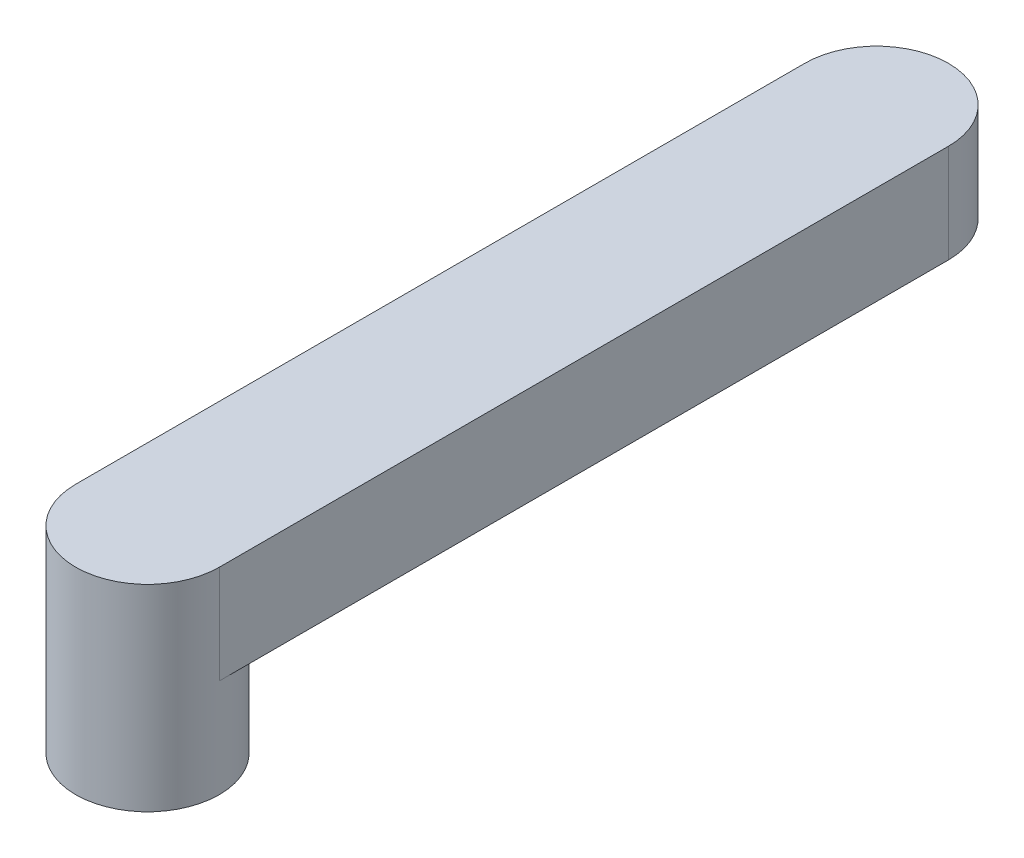
ISO-10303-21;
HEADER;
FILE_DESCRIPTION(('STEP AP214'),'2;1');
FILE_NAME('part.step','',(''),(''),'','','');
FILE_SCHEMA(('AUTOMOTIVE_DESIGN { 1 0 10303 214 1 1 1 1 }'));
ENDSEC;
DATA;
#1=APPLICATION_CONTEXT('core data for automotive mechanical design processes');
#2=APPLICATION_PROTOCOL_DEFINITION('international standard','automotive_design',2000,#1);
#3=PRODUCT_CONTEXT('',#1,'mechanical');
#4=PRODUCT('Part','Part','',(#3));
#5=PRODUCT_RELATED_PRODUCT_CATEGORY('part','',(#4));
#6=PRODUCT_DEFINITION_FORMATION('','',#4);
#7=PRODUCT_DEFINITION_CONTEXT('part definition',#1,'design');
#8=PRODUCT_DEFINITION('design','',#6,#7);
#9=PRODUCT_DEFINITION_SHAPE('','',#8);
#10=(LENGTH_UNIT() NAMED_UNIT(*) SI_UNIT(.MILLI.,.METRE.));
#11=(NAMED_UNIT(*) PLANE_ANGLE_UNIT() SI_UNIT($,.RADIAN.));
#12=(NAMED_UNIT(*) SI_UNIT($,.STERADIAN.) SOLID_ANGLE_UNIT());
#13=UNCERTAINTY_MEASURE_WITH_UNIT(LENGTH_MEASURE(1.E-05),#10,'distance_accuracy_value','');
#14=(GEOMETRIC_REPRESENTATION_CONTEXT(3) GLOBAL_UNCERTAINTY_ASSIGNED_CONTEXT((#13)) GLOBAL_UNIT_ASSIGNED_CONTEXT((#10,
#11,#12)) REPRESENTATION_CONTEXT('',''));
#15=CARTESIAN_POINT('',(0.,0.,0.));
#16=DIRECTION('',(0.,0.,1.));
#17=DIRECTION('',(1.,0.,0.));
#18=AXIS2_PLACEMENT_3D('',#15,#16,#17);
#19=CARTESIAN_POINT('',(2.2225,3.048,0.));
#20=DIRECTION('',(-1.,0.,0.));
#21=DIRECTION('',(0.,0.,1.));
#22=AXIS2_PLACEMENT_3D('',#19,#20,#21);
#23=PLANE('',#22);
#24=DIRECTION('',(0.,0.,-1.));
#25=VECTOR('',#24,1.);
#26=CARTESIAN_POINT('',(2.2225,0.,0.));
#27=LINE('',#26,#25);
#28=CARTESIAN_POINT('',(2.2225,0.,12.3979357320891));
#29=VERTEX_POINT('',#28);
#30=CARTESIAN_POINT('',(2.2225,0.,-10.16));
#31=VERTEX_POINT('',#30);
#32=EDGE_CURVE('E90',#29,#31,#27,.T.);
#33=ORIENTED_EDGE('',*,*,#32,.T.);
#34=DIRECTION('',(0.,-1.,0.));
#35=VECTOR('',#34,1.);
#36=CARTESIAN_POINT('',(2.2225,3.048,-10.16));
#37=LINE('',#36,#35);
#38=CARTESIAN_POINT('',(2.2225,3.048,-10.16));
#39=VERTEX_POINT('',#38);
#40=EDGE_CURVE('E11',#39,#31,#37,.T.);
#41=ORIENTED_EDGE('',*,*,#40,.F.);
#42=DIRECTION('',(0.,0.,-1.));
#43=VECTOR('',#42,1.);
#44=CARTESIAN_POINT('',(2.2225,3.048,0.));
#45=LINE('',#44,#43);
#46=CARTESIAN_POINT('',(2.2225,3.048,12.3979357320891));
#47=VERTEX_POINT('',#46);
#48=EDGE_CURVE('E91',#47,#39,#45,.T.);
#49=ORIENTED_EDGE('',*,*,#48,.F.);
#50=DIRECTION('',(0.,-1.,0.));
#51=VECTOR('',#50,1.);
#52=CARTESIAN_POINT('',(2.2225,3.048,12.3979357320891));
#53=LINE('',#52,#51);
#54=EDGE_CURVE('E79',#47,#29,#53,.T.);
#55=ORIENTED_EDGE('',*,*,#54,.T.);
#56=EDGE_LOOP('',(#33,#41,#49,#55));
#57=FACE_BOUND('',#56,.T.);
#58=ADVANCED_FACE('F35',(#57),#23,.F.);
#59=CARTESIAN_POINT('',(0.,3.048,-10.16));
#60=DIRECTION('',(0.,-1.,0.));
#61=DIRECTION('',(0.,0.,-1.));
#62=AXIS2_PLACEMENT_3D('',#59,#60,#61);
#63=CYLINDRICAL_SURFACE('',#62,2.2225);
#64=CARTESIAN_POINT('',(0.,0.,-10.16));
#65=DIRECTION('',(0.,1.,0.));
#66=DIRECTION('',(0.,0.,1.));
#67=AXIS2_PLACEMENT_3D('',#64,#65,#66);
#68=CIRCLE('',#67,2.2225);
#69=CARTESIAN_POINT('',(-2.2225,0.,-10.16));
#70=VERTEX_POINT('',#69);
#71=EDGE_CURVE('E85',#31,#70,#68,.T.);
#72=ORIENTED_EDGE('',*,*,#71,.T.);
#73=DIRECTION('',(0.,-1.,0.));
#74=VECTOR('',#73,1.);
#75=CARTESIAN_POINT('',(-2.2225,3.048,-10.16));
#76=LINE('',#75,#74);
#77=CARTESIAN_POINT('',(-2.2225,3.048,-10.16));
#78=VERTEX_POINT('',#77);
#79=EDGE_CURVE('E43',#78,#70,#76,.T.);
#80=ORIENTED_EDGE('',*,*,#79,.F.);
#81=CARTESIAN_POINT('',(0.,3.048,-10.16));
#82=DIRECTION('',(0.,1.,0.));
#83=DIRECTION('',(0.,0.,1.));
#84=AXIS2_PLACEMENT_3D('',#81,#82,#83);
#85=CIRCLE('',#84,2.2225);
#86=EDGE_CURVE('E51',#39,#78,#85,.T.);
#87=ORIENTED_EDGE('',*,*,#86,.F.);
#88=ORIENTED_EDGE('',*,*,#40,.T.);
#89=EDGE_LOOP('',(#72,#80,#87,#88));
#90=FACE_BOUND('',#89,.T.);
#91=ADVANCED_FACE('F103',(#90),#63,.T.);
#92=CARTESIAN_POINT('',(-2.2225,3.048,0.));
#93=DIRECTION('',(-1.,0.,0.));
#94=DIRECTION('',(0.,0.,1.));
#95=AXIS2_PLACEMENT_3D('',#92,#93,#94);
#96=PLANE('',#95);
#97=DIRECTION('',(0.,0.,-1.));
#98=VECTOR('',#97,1.);
#99=CARTESIAN_POINT('',(-2.2225,0.,0.));
#100=LINE('',#99,#98);
#101=CARTESIAN_POINT('',(-2.2225,0.,12.3979357320891));
#102=VERTEX_POINT('',#101);
#103=EDGE_CURVE('E82',#102,#70,#100,.T.);
#104=ORIENTED_EDGE('',*,*,#103,.F.);
#105=DIRECTION('',(0.,-1.,0.));
#106=VECTOR('',#105,1.);
#107=CARTESIAN_POINT('',(-2.2225,3.048,12.3979357320891));
#108=LINE('',#107,#106);
#109=CARTESIAN_POINT('',(-2.2225,3.048,12.3979357320891));
#110=VERTEX_POINT('',#109);
#111=EDGE_CURVE('E70',#110,#102,#108,.T.);
#112=ORIENTED_EDGE('',*,*,#111,.F.);
#113=DIRECTION('',(0.,0.,-1.));
#114=VECTOR('',#113,1.);
#115=CARTESIAN_POINT('',(-2.2225,3.048,0.));
#116=LINE('',#115,#114);
#117=EDGE_CURVE('E96',#110,#78,#116,.T.);
#118=ORIENTED_EDGE('',*,*,#117,.T.);
#119=ORIENTED_EDGE('',*,*,#79,.T.);
#120=EDGE_LOOP('',(#104,#112,#118,#119));
#121=FACE_BOUND('',#120,.T.);
#122=ADVANCED_FACE('F83',(#121),#96,.T.);
#123=CARTESIAN_POINT('',(0.,3.048,0.));
#124=DIRECTION('',(0.,1.,0.));
#125=DIRECTION('',(0.,0.,1.));
#126=AXIS2_PLACEMENT_3D('',#123,#124,#125);
#127=PLANE('',#126);
#128=ORIENTED_EDGE('',*,*,#48,.T.);
#129=ORIENTED_EDGE('',*,*,#86,.T.);
#130=ORIENTED_EDGE('',*,*,#117,.F.);
#131=CARTESIAN_POINT('',(0.,3.048,12.3979357320891));
#132=DIRECTION('',(0.,1.,0.));
#133=DIRECTION('',(0.,0.,1.));
#134=AXIS2_PLACEMENT_3D('',#131,#132,#133);
#135=CIRCLE('',#134,2.2225);
#136=EDGE_CURVE('E78',#110,#47,#135,.T.);
#137=ORIENTED_EDGE('',*,*,#136,.T.);
#138=EDGE_LOOP('',(#128,#129,#130,#137));
#139=FACE_BOUND('',#138,.T.);
#140=ADVANCED_FACE('F112',(#139),#127,.T.);
#141=CARTESIAN_POINT('',(0.,0.,0.));
#142=DIRECTION('',(0.,1.,0.));
#143=DIRECTION('',(0.,0.,1.));
#144=AXIS2_PLACEMENT_3D('',#141,#142,#143);
#145=PLANE('',#144);
#146=ORIENTED_EDGE('',*,*,#32,.F.);
#147=CARTESIAN_POINT('',(0.,0.,12.3979357320891));
#148=DIRECTION('',(0.,1.,0.));
#149=DIRECTION('',(0.,0.,1.));
#150=AXIS2_PLACEMENT_3D('',#147,#148,#149);
#151=CIRCLE('',#150,2.2225);
#152=EDGE_CURVE('E74',#29,#102,#151,.T.);
#153=ORIENTED_EDGE('',*,*,#152,.T.);
#154=ORIENTED_EDGE('',*,*,#103,.T.);
#155=ORIENTED_EDGE('',*,*,#71,.F.);
#156=EDGE_LOOP('',(#146,#153,#154,#155));
#157=FACE_BOUND('',#156,.T.);
#158=ADVANCED_FACE('F88',(#157),#145,.F.);
#159=CARTESIAN_POINT('',(0.,3.048,12.3979357320891));
#160=DIRECTION('',(0.,-1.,0.));
#161=DIRECTION('',(0.,0.,-1.));
#162=AXIS2_PLACEMENT_3D('',#159,#160,#161);
#163=CYLINDRICAL_SURFACE('',#162,2.2225);
#164=CARTESIAN_POINT('',(0.,-3.048,12.3979357320891));
#165=DIRECTION('',(0.,1.,0.));
#166=DIRECTION('',(0.,0.,1.));
#167=AXIS2_PLACEMENT_3D('',#164,#165,#166);
#168=CIRCLE('',#167,2.2225);
#169=CARTESIAN_POINT('',(0.,-3.048,14.6204357320891));
#170=VERTEX_POINT('',#169);
#171=EDGE_CURVE('E129',#170,#170,#168,.T.);
#172=ORIENTED_EDGE('',*,*,#171,.T.);
#173=EDGE_LOOP('',(#172));
#174=FACE_BOUND('',#173,.T.);
#175=ORIENTED_EDGE('',*,*,#152,.F.);
#176=ORIENTED_EDGE('',*,*,#54,.F.);
#177=ORIENTED_EDGE('',*,*,#136,.F.);
#178=ORIENTED_EDGE('',*,*,#111,.T.);
#179=EDGE_LOOP('',(#175,#176,#177,#178));
#180=FACE_BOUND('',#179,.T.);
#181=ADVANCED_FACE('F71',(#174,#180),#163,.T.);
#182=CARTESIAN_POINT('',(0.,-3.048,0.));
#183=DIRECTION('',(0.,1.,0.));
#184=DIRECTION('',(0.,0.,1.));
#185=AXIS2_PLACEMENT_3D('',#182,#183,#184);
#186=PLANE('',#185);
#187=ORIENTED_EDGE('',*,*,#171,.F.);
#188=EDGE_LOOP('',(#187));
#189=FACE_BOUND('',#188,.T.);
#190=ADVANCED_FACE('F121',(#189),#186,.F.);
#191=CLOSED_SHELL('',(#58,#91,#122,#140,#158,#181,#190));
#192=MANIFOLD_SOLID_BREP('B2',#191);
#193=ADVANCED_BREP_SHAPE_REPRESENTATION('',(#18,#192),#14);
#194=SHAPE_DEFINITION_REPRESENTATION(#9,#193);
ENDSEC;
END-ISO-10303-21;
